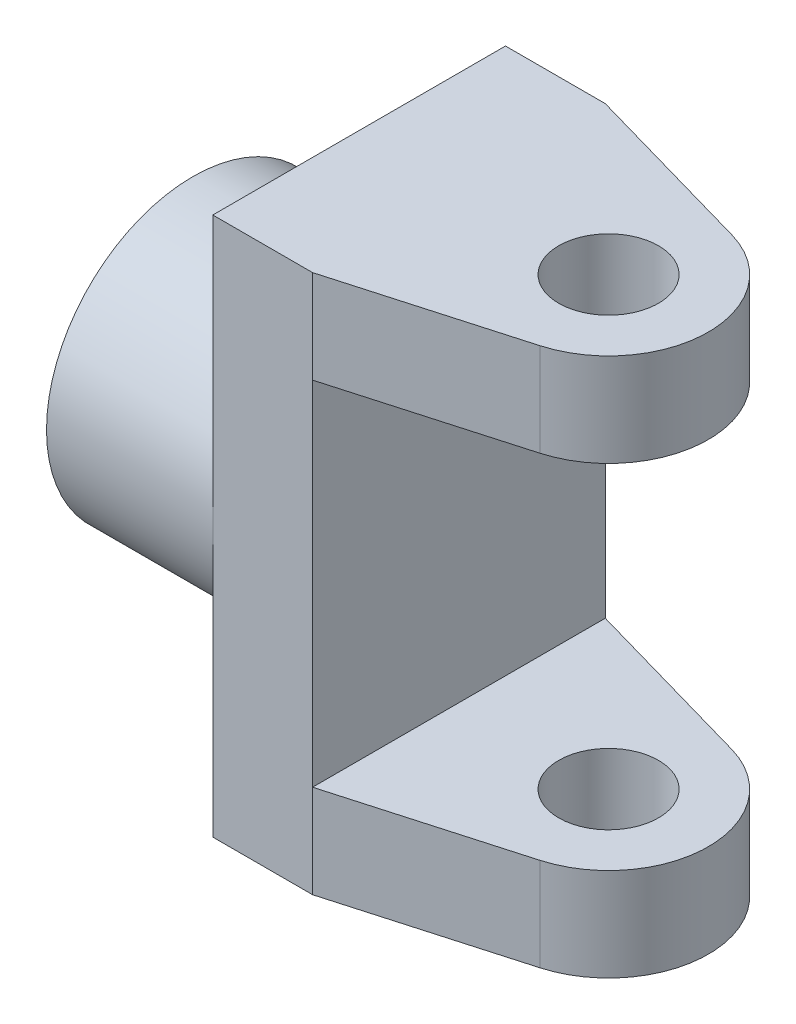
ISO-10303-21;
HEADER;
FILE_DESCRIPTION(('STEP AP214'),'2;1');
FILE_NAME('part.step','',(''),(''),'','','');
FILE_SCHEMA(('AUTOMOTIVE_DESIGN { 1 0 10303 214 1 1 1 1 }'));
ENDSEC;
DATA;
#1=APPLICATION_CONTEXT('core data for automotive mechanical design processes');
#2=APPLICATION_PROTOCOL_DEFINITION('international standard','automotive_design',2000,#1);
#3=PRODUCT_CONTEXT('',#1,'mechanical');
#4=PRODUCT('Part','Part','',(#3));
#5=PRODUCT_RELATED_PRODUCT_CATEGORY('part','',(#4));
#6=PRODUCT_DEFINITION_FORMATION('','',#4);
#7=PRODUCT_DEFINITION_CONTEXT('part definition',#1,'design');
#8=PRODUCT_DEFINITION('design','',#6,#7);
#9=PRODUCT_DEFINITION_SHAPE('','',#8);
#10=(LENGTH_UNIT() NAMED_UNIT(*) SI_UNIT(.MILLI.,.METRE.));
#11=(NAMED_UNIT(*) PLANE_ANGLE_UNIT() SI_UNIT($,.RADIAN.));
#12=(NAMED_UNIT(*) SI_UNIT($,.STERADIAN.) SOLID_ANGLE_UNIT());
#13=UNCERTAINTY_MEASURE_WITH_UNIT(LENGTH_MEASURE(1.E-05),#10,'distance_accuracy_value','');
#14=(GEOMETRIC_REPRESENTATION_CONTEXT(3) GLOBAL_UNCERTAINTY_ASSIGNED_CONTEXT((#13)) GLOBAL_UNIT_ASSIGNED_CONTEXT((#10,
#11,#12)) REPRESENTATION_CONTEXT('',''));
#15=CARTESIAN_POINT('',(0.,0.,0.));
#16=DIRECTION('',(0.,0.,1.));
#17=DIRECTION('',(1.,0.,0.));
#18=AXIS2_PLACEMENT_3D('',#15,#16,#17);
#19=CARTESIAN_POINT('',(38.359674224501,0.356043956043962,57.2253028517175));
#20=DIRECTION('',(1.,0.,0.));
#21=DIRECTION('',(0.,0.,-1.));
#22=AXIS2_PLACEMENT_3D('',#19,#20,#21);
#23=PLANE('',#22);
#24=CARTESIAN_POINT('',(38.359674224501,0.508634222919944,44.0253028517175));
#25=DIRECTION('',(-1.,0.,0.));
#26=DIRECTION('',(0.,0.,1.));
#27=AXIS2_PLACEMENT_3D('',#24,#25,#26);
#28=CIRCLE('',#27,13.2);
#29=CARTESIAN_POINT('',(38.359674224501,0.508634222919944,57.2253028517175));
#30=VERTEX_POINT('',#29);
#31=CARTESIAN_POINT('',(38.359674224501,0.508634222919944,30.8253028517175));
#32=VERTEX_POINT('',#31);
#33=EDGE_CURVE('E64',#30,#32,#28,.T.);
#34=ORIENTED_EDGE('',*,*,#33,.F.);
#35=DIRECTION('',(0.,-1.,0.));
#36=VECTOR('',#35,1.);
#37=CARTESIAN_POINT('',(38.359674224501,0.356043956043962,57.2253028517175));
#38=LINE('',#37,#36);
#39=CARTESIAN_POINT('',(38.359674224501,24.8086342229199,57.2253028517175));
#40=VERTEX_POINT('',#39);
#41=EDGE_CURVE('E274',#40,#30,#38,.T.);
#42=ORIENTED_EDGE('',*,*,#41,.F.);
#43=DIRECTION('',(0.,0.,-1.));
#44=VECTOR('',#43,1.);
#45=CARTESIAN_POINT('',(38.359674224501,24.8086342229199,57.2253028517175));
#46=LINE('',#45,#44);
#47=CARTESIAN_POINT('',(38.359674224501,24.8086342229199,30.8253028517175));
#48=VERTEX_POINT('',#47);
#49=EDGE_CURVE('E290',#40,#48,#46,.T.);
#50=ORIENTED_EDGE('',*,*,#49,.T.);
#51=DIRECTION('',(0.,-1.,0.));
#52=VECTOR('',#51,1.);
#53=CARTESIAN_POINT('',(38.359674224501,0.356043956043962,30.8253028517175));
#54=LINE('',#53,#52);
#55=EDGE_CURVE('E267',#48,#32,#54,.T.);
#56=ORIENTED_EDGE('',*,*,#55,.T.);
#57=EDGE_LOOP('',(#34,#42,#50,#56));
#58=FACE_BOUND('',#57,.T.);
#59=ADVANCED_FACE('F54',(#58),#23,.F.);
#60=CARTESIAN_POINT('',(30.1605696419081,-23.7913657770801,57.2253028517175));
#61=DIRECTION('',(0.,1.,0.));
#62=DIRECTION('',(0.,0.,1.));
#63=AXIS2_PLACEMENT_3D('',#60,#61,#62);
#64=PLANE('',#63);
#65=CARTESIAN_POINT('',(60.859674224501,-23.7913657770801,44.0253028517175));
#66=DIRECTION('',(0.,1.,0.));
#67=DIRECTION('',(-1.,0.,0.));
#68=AXIS2_PLACEMENT_3D('',#65,#66,#67);
#69=CIRCLE('',#68,4.5);
#70=CARTESIAN_POINT('',(56.359674224501,-23.7913657770801,44.0253028517175));
#71=VERTEX_POINT('',#70);
#72=EDGE_CURVE('E205',#71,#71,#69,.T.);
#73=ORIENTED_EDGE('',*,*,#72,.T.);
#74=EDGE_LOOP('',(#73));
#75=FACE_BOUND('',#74,.T.);
#76=CARTESIAN_POINT('',(60.859674224501,-23.7913657770801,44.0253028517175));
#77=DIRECTION('',(0.,1.,0.));
#78=DIRECTION('',(-1.,0.,0.));
#79=AXIS2_PLACEMENT_3D('',#76,#77,#78);
#80=CIRCLE('',#79,9.);
#81=CARTESIAN_POINT('',(63.3235007053642,-23.7913657770801,52.6814890253275));
#82=VERTEX_POINT('',#81);
#83=CARTESIAN_POINT('',(63.3235007053642,-23.7913657770801,35.3691166781074));
#84=VERTEX_POINT('',#83);
#85=EDGE_CURVE('E236',#82,#84,#80,.T.);
#86=ORIENTED_EDGE('',*,*,#85,.F.);
#87=DIRECTION('',(0.961798463734448,0.,-0.273758497873683));
#88=VECTOR('',#87,1.);
#89=CARTESIAN_POINT('',(38.4006677077134,-23.7913657770801,59.7753216539449));
#90=LINE('',#89,#88);
#91=CARTESIAN_POINT('',(47.359674224501,-23.7913657770801,57.2253028517175));
#92=VERTEX_POINT('',#91);
#93=EDGE_CURVE('E217',#92,#82,#90,.T.);
#94=ORIENTED_EDGE('',*,*,#93,.F.);
#95=DIRECTION('',(1.,0.,0.));
#96=VECTOR('',#95,1.);
#97=CARTESIAN_POINT('',(30.1605696419081,-23.7913657770801,57.2253028517175));
#98=LINE('',#97,#96);
#99=CARTESIAN_POINT('',(38.359674224501,-23.7913657770801,57.2253028517175));
#100=VERTEX_POINT('',#99);
#101=EDGE_CURVE('E263',#100,#92,#98,.T.);
#102=ORIENTED_EDGE('',*,*,#101,.F.);
#103=DIRECTION('',(0.,0.,-1.));
#104=VECTOR('',#103,1.);
#105=CARTESIAN_POINT('',(38.359674224501,-23.7913657770801,57.2253028517175));
#106=LINE('',#105,#104);
#107=CARTESIAN_POINT('',(38.359674224501,-23.7913657770801,30.8253028517175));
#108=VERTEX_POINT('',#107);
#109=EDGE_CURVE('E276',#100,#108,#106,.T.);
#110=ORIENTED_EDGE('',*,*,#109,.T.);
#111=DIRECTION('',(1.,0.,0.));
#112=VECTOR('',#111,1.);
#113=CARTESIAN_POINT('',(30.1605696419081,-23.7913657770801,30.8253028517175));
#114=LINE('',#113,#112);
#115=CARTESIAN_POINT('',(47.359674224501,-23.7913657770801,30.8253028517175));
#116=VERTEX_POINT('',#115);
#117=EDGE_CURVE('E262',#108,#116,#114,.T.);
#118=ORIENTED_EDGE('',*,*,#117,.T.);
#119=DIRECTION('',(0.961798463734448,0.,0.273758497873683));
#120=VECTOR('',#119,1.);
#121=CARTESIAN_POINT('',(31.4495344367196,-23.7913657770801,26.2967699693174));
#122=LINE('',#121,#120);
#123=EDGE_CURVE('E238',#116,#84,#122,.T.);
#124=ORIENTED_EDGE('',*,*,#123,.T.);
#125=EDGE_LOOP('',(#86,#94,#102,#110,#118,#124));
#126=FACE_BOUND('',#125,.T.);
#127=ADVANCED_FACE('F56',(#75,#126),#64,.F.);
#128=CARTESIAN_POINT('',(30.1605696419081,-15.3913657770801,57.2253028517175));
#129=DIRECTION('',(0.,1.,0.));
#130=DIRECTION('',(0.,0.,1.));
#131=AXIS2_PLACEMENT_3D('',#128,#129,#130);
#132=PLANE('',#131);
#133=CARTESIAN_POINT('',(60.859674224501,-15.3913657770801,44.0253028517175));
#134=DIRECTION('',(0.,1.,0.));
#135=DIRECTION('',(0.,0.,1.));
#136=AXIS2_PLACEMENT_3D('',#133,#134,#135);
#137=CIRCLE('',#136,4.5);
#138=CARTESIAN_POINT('',(60.859674224501,-15.3913657770801,48.5253028517175));
#139=VERTEX_POINT('',#138);
#140=EDGE_CURVE('E213',#139,#139,#137,.T.);
#141=ORIENTED_EDGE('',*,*,#140,.F.);
#142=EDGE_LOOP('',(#141));
#143=FACE_BOUND('',#142,.T.);
#144=DIRECTION('',(0.961798463734448,0.,-0.273758497873683));
#145=VECTOR('',#144,1.);
#146=CARTESIAN_POINT('',(31.4495344367196,-15.3913657770801,61.7538357341176));
#147=LINE('',#146,#145);
#148=CARTESIAN_POINT('',(47.359674224501,-15.3913657770801,57.2253028517175));
#149=VERTEX_POINT('',#148);
#150=CARTESIAN_POINT('',(63.3235007053642,-15.3913657770801,52.6814890253275));
#151=VERTEX_POINT('',#150);
#152=EDGE_CURVE('E232',#149,#151,#147,.T.);
#153=ORIENTED_EDGE('',*,*,#152,.T.);
#154=CARTESIAN_POINT('',(60.859674224501,-15.3913657770801,44.0253028517175));
#155=DIRECTION('',(0.,1.,0.));
#156=DIRECTION('',(0.,0.,1.));
#157=AXIS2_PLACEMENT_3D('',#154,#155,#156);
#158=CIRCLE('',#157,9.);
#159=CARTESIAN_POINT('',(63.3235007053642,-15.3913657770801,35.3691166781074));
#160=VERTEX_POINT('',#159);
#161=EDGE_CURVE('E259',#151,#160,#158,.T.);
#162=ORIENTED_EDGE('',*,*,#161,.T.);
#163=DIRECTION('',(0.961798463734448,0.,0.273758497873683));
#164=VECTOR('',#163,1.);
#165=CARTESIAN_POINT('',(38.4006677077134,-15.3913657770801,28.27528404949));
#166=LINE('',#165,#164);
#167=CARTESIAN_POINT('',(47.359674224501,-15.3913657770801,30.8253028517175));
#168=VERTEX_POINT('',#167);
#169=EDGE_CURVE('E255',#168,#160,#166,.T.);
#170=ORIENTED_EDGE('',*,*,#169,.F.);
#171=DIRECTION('',(0.,0.,-1.));
#172=VECTOR('',#171,1.);
#173=CARTESIAN_POINT('',(47.359674224501,-15.3913657770801,57.2253028517175));
#174=LINE('',#173,#172);
#175=EDGE_CURVE('E295',#149,#168,#174,.T.);
#176=ORIENTED_EDGE('',*,*,#175,.F.);
#177=EDGE_LOOP('',(#153,#162,#170,#176));
#178=FACE_BOUND('',#177,.T.);
#179=ADVANCED_FACE('F325',(#143,#178),#132,.T.);
#180=CARTESIAN_POINT('',(30.1605696419081,16.4086342229199,57.2253028517175));
#181=DIRECTION('',(0.,1.,0.));
#182=DIRECTION('',(0.,0.,1.));
#183=AXIS2_PLACEMENT_3D('',#180,#181,#182);
#184=PLANE('',#183);
#185=CARTESIAN_POINT('',(60.859674224501,16.40863422292,44.0253028517175));
#186=DIRECTION('',(0.,1.,0.));
#187=DIRECTION('',(0.,0.,1.));
#188=AXIS2_PLACEMENT_3D('',#185,#186,#187);
#189=CIRCLE('',#188,4.5);
#190=CARTESIAN_POINT('',(60.859674224501,16.40863422292,48.5253028517175));
#191=VERTEX_POINT('',#190);
#192=EDGE_CURVE('E208',#191,#191,#189,.T.);
#193=ORIENTED_EDGE('',*,*,#192,.T.);
#194=EDGE_LOOP('',(#193));
#195=FACE_BOUND('',#194,.T.);
#196=CARTESIAN_POINT('',(60.859674224501,16.40863422292,44.0253028517175));
#197=DIRECTION('',(0.,1.,0.));
#198=DIRECTION('',(0.,0.,1.));
#199=AXIS2_PLACEMENT_3D('',#196,#197,#198);
#200=CIRCLE('',#199,9.);
#201=CARTESIAN_POINT('',(63.3235007053641,16.40863422292,52.6814890253275));
#202=VERTEX_POINT('',#201);
#203=CARTESIAN_POINT('',(63.3235007053641,16.40863422292,35.3691166781074));
#204=VERTEX_POINT('',#203);
#205=EDGE_CURVE('E257',#202,#204,#200,.T.);
#206=ORIENTED_EDGE('',*,*,#205,.F.);
#207=DIRECTION('',(0.961798463734448,0.,-0.273758497873683));
#208=VECTOR('',#207,1.);
#209=CARTESIAN_POINT('',(31.4495344367196,16.4086342229199,61.7538357341176));
#210=LINE('',#209,#208);
#211=CARTESIAN_POINT('',(47.359674224501,16.4086342229199,57.2253028517175));
#212=VERTEX_POINT('',#211);
#213=EDGE_CURVE('E226',#212,#202,#210,.T.);
#214=ORIENTED_EDGE('',*,*,#213,.F.);
#215=DIRECTION('',(0.,0.,-1.));
#216=VECTOR('',#215,1.);
#217=CARTESIAN_POINT('',(47.359674224501,16.4086342229199,57.2253028517175));
#218=LINE('',#217,#216);
#219=CARTESIAN_POINT('',(47.359674224501,16.4086342229199,30.8253028517175));
#220=VERTEX_POINT('',#219);
#221=EDGE_CURVE('E292',#212,#220,#218,.T.);
#222=ORIENTED_EDGE('',*,*,#221,.T.);
#223=DIRECTION('',(0.961798463734448,0.,0.273758497873683));
#224=VECTOR('',#223,1.);
#225=CARTESIAN_POINT('',(38.4006677077134,16.4086342229199,28.27528404949));
#226=LINE('',#225,#224);
#227=EDGE_CURVE('E250',#220,#204,#226,.T.);
#228=ORIENTED_EDGE('',*,*,#227,.T.);
#229=EDGE_LOOP('',(#206,#214,#222,#228));
#230=FACE_BOUND('',#229,.T.);
#231=ADVANCED_FACE('F331',(#195,#230),#184,.F.);
#232=CARTESIAN_POINT('',(30.1605696419081,24.8086342229199,57.2253028517175));
#233=DIRECTION('',(0.,1.,0.));
#234=DIRECTION('',(-1.,0.,0.));
#235=AXIS2_PLACEMENT_3D('',#232,#233,#234);
#236=PLANE('',#235);
#237=CARTESIAN_POINT('',(60.859674224501,24.8086342229199,44.0253028517175));
#238=DIRECTION('',(0.,1.,0.));
#239=DIRECTION('',(-1.,0.,0.));
#240=AXIS2_PLACEMENT_3D('',#237,#238,#239);
#241=CIRCLE('',#240,4.5);
#242=CARTESIAN_POINT('',(56.359674224501,24.8086342229199,44.0253028517175));
#243=VERTEX_POINT('',#242);
#244=EDGE_CURVE('E202',#243,#243,#241,.T.);
#245=ORIENTED_EDGE('',*,*,#244,.F.);
#246=EDGE_LOOP('',(#245));
#247=FACE_BOUND('',#246,.T.);
#248=DIRECTION('',(0.961798463734448,0.,-0.273758497873683));
#249=VECTOR('',#248,1.);
#250=CARTESIAN_POINT('',(38.4006677077134,24.8086342229199,59.7753216539449));
#251=LINE('',#250,#249);
#252=CARTESIAN_POINT('',(47.359674224501,24.8086342229199,57.2253028517175));
#253=VERTEX_POINT('',#252);
#254=CARTESIAN_POINT('',(63.3235007053641,24.8086342229199,52.6814890253275));
#255=VERTEX_POINT('',#254);
#256=EDGE_CURVE('E216',#253,#255,#251,.T.);
#257=ORIENTED_EDGE('',*,*,#256,.T.);
#258=CARTESIAN_POINT('',(60.859674224501,24.8086342229199,44.0253028517175));
#259=DIRECTION('',(0.,1.,0.));
#260=DIRECTION('',(-1.,0.,0.));
#261=AXIS2_PLACEMENT_3D('',#258,#259,#260);
#262=CIRCLE('',#261,9.);
#263=CARTESIAN_POINT('',(63.3235007053641,24.8086342229199,35.3691166781074));
#264=VERTEX_POINT('',#263);
#265=EDGE_CURVE('E235',#255,#264,#262,.T.);
#266=ORIENTED_EDGE('',*,*,#265,.T.);
#267=DIRECTION('',(0.961798463734448,0.,0.273758497873683));
#268=VECTOR('',#267,1.);
#269=CARTESIAN_POINT('',(31.4495344367196,24.8086342229199,26.2967699693174));
#270=LINE('',#269,#268);
#271=CARTESIAN_POINT('',(47.359674224501,24.8086342229199,30.8253028517175));
#272=VERTEX_POINT('',#271);
#273=EDGE_CURVE('E239',#272,#264,#270,.T.);
#274=ORIENTED_EDGE('',*,*,#273,.F.);
#275=DIRECTION('',(1.,0.,0.));
#276=VECTOR('',#275,1.);
#277=CARTESIAN_POINT('',(30.1605696419081,24.8086342229199,30.8253028517175));
#278=LINE('',#277,#276);
#279=EDGE_CURVE('E282',#48,#272,#278,.T.);
#280=ORIENTED_EDGE('',*,*,#279,.F.);
#281=ORIENTED_EDGE('',*,*,#49,.F.);
#282=DIRECTION('',(1.,0.,0.));
#283=VECTOR('',#282,1.);
#284=CARTESIAN_POINT('',(30.1605696419081,24.8086342229199,57.2253028517175));
#285=LINE('',#284,#283);
#286=EDGE_CURVE('E270',#40,#253,#285,.T.);
#287=ORIENTED_EDGE('',*,*,#286,.T.);
#288=EDGE_LOOP('',(#257,#266,#274,#280,#281,#287));
#289=FACE_BOUND('',#288,.T.);
#290=ADVANCED_FACE('F308',(#247,#289),#236,.T.);
#291=CARTESIAN_POINT('',(30.1605696419081,0.356043956043962,57.2253028517175));
#292=DIRECTION('',(0.,0.,1.));
#293=DIRECTION('',(1.,0.,0.));
#294=AXIS2_PLACEMENT_3D('',#291,#292,#293);
#295=PLANE('',#294);
#296=ORIENTED_EDGE('',*,*,#101,.T.);
#297=DIRECTION('',(0.,1.,0.));
#298=VECTOR('',#297,1.);
#299=CARTESIAN_POINT('',(47.359674224501,-23.7913657770801,57.2253028517175));
#300=LINE('',#299,#298);
#301=EDGE_CURVE('E223',#92,#149,#300,.T.);
#302=ORIENTED_EDGE('',*,*,#301,.T.);
#303=DIRECTION('',(0.,-1.,0.));
#304=VECTOR('',#303,1.);
#305=CARTESIAN_POINT('',(47.359674224501,0.356043956043965,57.2253028517175));
#306=LINE('',#305,#304);
#307=EDGE_CURVE('E266',#212,#149,#306,.T.);
#308=ORIENTED_EDGE('',*,*,#307,.F.);
#309=DIRECTION('',(0.,1.,0.));
#310=VECTOR('',#309,1.);
#311=CARTESIAN_POINT('',(47.359674224501,0.356043956043965,57.2253028517175));
#312=LINE('',#311,#310);
#313=EDGE_CURVE('E58',#212,#253,#312,.T.);
#314=ORIENTED_EDGE('',*,*,#313,.T.);
#315=ORIENTED_EDGE('',*,*,#286,.F.);
#316=ORIENTED_EDGE('',*,*,#41,.T.);
#317=EDGE_CURVE('E273',#30,#100,#38,.T.);
#318=ORIENTED_EDGE('',*,*,#317,.T.);
#319=EDGE_LOOP('',(#296,#302,#308,#314,#315,#316,#318));
#320=FACE_BOUND('',#319,.T.);
#321=ADVANCED_FACE('F304',(#320),#295,.T.);
#322=CARTESIAN_POINT('',(47.359674224501,0.356043956043965,57.2253028517175));
#323=DIRECTION('',(1.,0.,0.));
#324=DIRECTION('',(0.,1.,0.));
#325=AXIS2_PLACEMENT_3D('',#322,#323,#324);
#326=PLANE('',#325);
#327=DIRECTION('',(0.,-1.,0.));
#328=VECTOR('',#327,1.);
#329=CARTESIAN_POINT('',(47.359674224501,0.356043956043965,30.8253028517175));
#330=LINE('',#329,#328);
#331=EDGE_CURVE('E279',#220,#168,#330,.T.);
#332=ORIENTED_EDGE('',*,*,#331,.F.);
#333=ORIENTED_EDGE('',*,*,#221,.F.);
#334=ORIENTED_EDGE('',*,*,#307,.T.);
#335=ORIENTED_EDGE('',*,*,#175,.T.);
#336=EDGE_LOOP('',(#332,#333,#334,#335));
#337=FACE_BOUND('',#336,.T.);
#338=ADVANCED_FACE('F329',(#337),#326,.T.);
#339=EDGE_CURVE('E12',#32,#30,#28,.T.);
#340=ORIENTED_EDGE('',*,*,#339,.F.);
#341=EDGE_CURVE('E285',#32,#108,#54,.T.);
#342=ORIENTED_EDGE('',*,*,#341,.T.);
#343=ORIENTED_EDGE('',*,*,#109,.F.);
#344=ORIENTED_EDGE('',*,*,#317,.F.);
#345=EDGE_LOOP('',(#340,#342,#343,#344));
#346=FACE_BOUND('',#345,.T.);
#347=ADVANCED_FACE('F316',(#346),#23,.F.);
#348=CARTESIAN_POINT('',(30.1605696419081,0.356043956043962,30.8253028517175));
#349=DIRECTION('',(0.,0.,1.));
#350=DIRECTION('',(1.,0.,0.));
#351=AXIS2_PLACEMENT_3D('',#348,#349,#350);
#352=PLANE('',#351);
#353=ORIENTED_EDGE('',*,*,#279,.T.);
#354=DIRECTION('',(0.,-1.,0.));
#355=VECTOR('',#354,1.);
#356=CARTESIAN_POINT('',(47.359674224501,0.356043956043965,30.8253028517175));
#357=LINE('',#356,#355);
#358=EDGE_CURVE('E297',#272,#220,#357,.T.);
#359=ORIENTED_EDGE('',*,*,#358,.T.);
#360=ORIENTED_EDGE('',*,*,#331,.T.);
#361=DIRECTION('',(0.,1.,0.));
#362=VECTOR('',#361,1.);
#363=CARTESIAN_POINT('',(47.359674224501,-23.7913657770801,30.8253028517175));
#364=LINE('',#363,#362);
#365=EDGE_CURVE('E242',#116,#168,#364,.T.);
#366=ORIENTED_EDGE('',*,*,#365,.F.);
#367=ORIENTED_EDGE('',*,*,#117,.F.);
#368=ORIENTED_EDGE('',*,*,#341,.F.);
#369=ORIENTED_EDGE('',*,*,#55,.F.);
#370=EDGE_LOOP('',(#353,#359,#360,#366,#367,#368,#369));
#371=FACE_BOUND('',#370,.T.);
#372=ADVANCED_FACE('F339',(#371),#352,.F.);
#373=CARTESIAN_POINT('',(31.4495344367196,-23.7913657770801,26.2967699693174));
#374=DIRECTION('',(-0.273758497873683,0.,0.961798463734448));
#375=DIRECTION('',(0.961798463734448,0.,0.273758497873683));
#376=AXIS2_PLACEMENT_3D('',#373,#374,#375);
#377=PLANE('',#376);
#378=ORIENTED_EDGE('',*,*,#169,.T.);
#379=DIRECTION('',(0.,1.,0.));
#380=VECTOR('',#379,1.);
#381=CARTESIAN_POINT('',(63.3235007053642,-23.7913657770801,35.3691166781074));
#382=LINE('',#381,#380);
#383=EDGE_CURVE('E247',#84,#160,#382,.T.);
#384=ORIENTED_EDGE('',*,*,#383,.F.);
#385=ORIENTED_EDGE('',*,*,#123,.F.);
#386=ORIENTED_EDGE('',*,*,#365,.T.);
#387=EDGE_LOOP('',(#378,#384,#385,#386));
#388=FACE_BOUND('',#387,.T.);
#389=ADVANCED_FACE('F439',(#388),#377,.F.);
#390=CARTESIAN_POINT('',(60.859674224501,-23.7913657770801,44.0253028517175));
#391=DIRECTION('',(0.,1.,0.));
#392=DIRECTION('',(-1.,0.,0.));
#393=AXIS2_PLACEMENT_3D('',#390,#391,#392);
#394=CYLINDRICAL_SURFACE('',#393,9.);
#395=ORIENTED_EDGE('',*,*,#161,.F.);
#396=DIRECTION('',(0.,1.,0.));
#397=VECTOR('',#396,1.);
#398=CARTESIAN_POINT('',(63.3235007053642,-23.7913657770801,52.6814890253275));
#399=LINE('',#398,#397);
#400=EDGE_CURVE('E227',#82,#151,#399,.T.);
#401=ORIENTED_EDGE('',*,*,#400,.F.);
#402=ORIENTED_EDGE('',*,*,#85,.T.);
#403=ORIENTED_EDGE('',*,*,#383,.T.);
#404=EDGE_LOOP('',(#395,#401,#402,#403));
#405=FACE_BOUND('',#404,.T.);
#406=ADVANCED_FACE('F447',(#405),#394,.T.);
#407=ORIENTED_EDGE('',*,*,#205,.T.);
#408=EDGE_CURVE('E251',#204,#264,#382,.T.);
#409=ORIENTED_EDGE('',*,*,#408,.T.);
#410=ORIENTED_EDGE('',*,*,#265,.F.);
#411=EDGE_CURVE('E220',#202,#255,#399,.T.);
#412=ORIENTED_EDGE('',*,*,#411,.F.);
#413=EDGE_LOOP('',(#407,#409,#410,#412));
#414=FACE_BOUND('',#413,.T.);
#415=ADVANCED_FACE('F336',(#414),#394,.T.);
#416=ORIENTED_EDGE('',*,*,#358,.F.);
#417=ORIENTED_EDGE('',*,*,#273,.T.);
#418=ORIENTED_EDGE('',*,*,#408,.F.);
#419=ORIENTED_EDGE('',*,*,#227,.F.);
#420=EDGE_LOOP('',(#416,#417,#418,#419));
#421=FACE_BOUND('',#420,.T.);
#422=ADVANCED_FACE('F430',(#421),#377,.F.);
#423=CARTESIAN_POINT('',(38.4006677077134,-23.7913657770801,59.7753216539449));
#424=DIRECTION('',(0.273758497873683,0.,0.961798463734448));
#425=DIRECTION('',(0.961798463734448,0.,-0.273758497873683));
#426=AXIS2_PLACEMENT_3D('',#423,#424,#425);
#427=PLANE('',#426);
#428=ORIENTED_EDGE('',*,*,#213,.T.);
#429=ORIENTED_EDGE('',*,*,#411,.T.);
#430=ORIENTED_EDGE('',*,*,#256,.F.);
#431=ORIENTED_EDGE('',*,*,#313,.F.);
#432=EDGE_LOOP('',(#428,#429,#430,#431));
#433=FACE_BOUND('',#432,.T.);
#434=ADVANCED_FACE('F334',(#433),#427,.T.);
#435=ORIENTED_EDGE('',*,*,#301,.F.);
#436=ORIENTED_EDGE('',*,*,#93,.T.);
#437=ORIENTED_EDGE('',*,*,#400,.T.);
#438=ORIENTED_EDGE('',*,*,#152,.F.);
#439=EDGE_LOOP('',(#435,#436,#437,#438));
#440=FACE_BOUND('',#439,.T.);
#441=ADVANCED_FACE('F413',(#440),#427,.T.);
#442=CARTESIAN_POINT('',(60.859674224501,-23.7913657770801,44.0253028517175));
#443=DIRECTION('',(0.,1.,0.));
#444=DIRECTION('',(-1.,0.,0.));
#445=AXIS2_PLACEMENT_3D('',#442,#443,#444);
#446=CYLINDRICAL_SURFACE('',#445,4.5);
#447=ORIENTED_EDGE('',*,*,#244,.T.);
#448=EDGE_LOOP('',(#447));
#449=FACE_BOUND('',#448,.T.);
#450=ORIENTED_EDGE('',*,*,#192,.F.);
#451=EDGE_LOOP('',(#450));
#452=FACE_BOUND('',#451,.T.);
#453=ADVANCED_FACE('F351',(#449,#452),#446,.F.);
#454=ORIENTED_EDGE('',*,*,#140,.T.);
#455=EDGE_LOOP('',(#454));
#456=FACE_BOUND('',#455,.T.);
#457=ORIENTED_EDGE('',*,*,#72,.F.);
#458=EDGE_LOOP('',(#457));
#459=FACE_BOUND('',#458,.T.);
#460=ADVANCED_FACE('F343',(#456,#459),#446,.F.);
#461=CARTESIAN_POINT('',(23.359674224501,0.508634222919944,44.0253028517175));
#462=DIRECTION('',(1.,0.,0.));
#463=DIRECTION('',(0.,0.,-1.));
#464=AXIS2_PLACEMENT_3D('',#461,#462,#463);
#465=CYLINDRICAL_SURFACE('',#464,13.2);
#466=CARTESIAN_POINT('',(23.359674224501,0.508634222919944,44.0253028517175));
#467=DIRECTION('',(-1.,0.,0.));
#468=DIRECTION('',(0.,0.,1.));
#469=AXIS2_PLACEMENT_3D('',#466,#467,#468);
#470=CIRCLE('',#469,13.2);
#471=CARTESIAN_POINT('',(23.359674224501,0.508634222919944,57.2253028517175));
#472=VERTEX_POINT('',#471);
#473=EDGE_CURVE('E200',#472,#472,#470,.T.);
#474=ORIENTED_EDGE('',*,*,#473,.F.);
#475=EDGE_LOOP('',(#474));
#476=FACE_BOUND('',#475,.T.);
#477=ORIENTED_EDGE('',*,*,#33,.T.);
#478=ORIENTED_EDGE('',*,*,#339,.T.);
#479=EDGE_LOOP('',(#477,#478));
#480=FACE_BOUND('',#479,.T.);
#481=ADVANCED_FACE('F341',(#476,#480),#465,.T.);
#482=CARTESIAN_POINT('',(23.359674224501,0.508634222919944,44.0253028517175));
#483=DIRECTION('',(-1.,0.,0.));
#484=DIRECTION('',(0.,0.,1.));
#485=AXIS2_PLACEMENT_3D('',#482,#483,#484);
#486=PLANE('',#485);
#487=DIRECTION('',(0.,0.,-1.));
#488=VECTOR('',#487,1.);
#489=CARTESIAN_POINT('',(23.359674224501,-0.691365777080056,38.1465274690378));
#490=LINE('',#489,#488);
#491=CARTESIAN_POINT('',(23.359674224501,-0.691365777080056,38.1465274690378));
#492=VERTEX_POINT('',#491);
#493=CARTESIAN_POINT('',(23.359674224501,-0.691365777080056,36.9465274690379));
#494=VERTEX_POINT('',#493);
#495=EDGE_CURVE('E171',#492,#494,#490,.T.);
#496=ORIENTED_EDGE('',*,*,#495,.T.);
#497=DIRECTION('',(0.,-1.,0.));
#498=VECTOR('',#497,1.);
#499=CARTESIAN_POINT('',(23.359674224501,1.70863422291994,36.9465274690378));
#500=LINE('',#499,#498);
#501=CARTESIAN_POINT('',(23.359674224501,1.70863422291994,36.9465274690378));
#502=VERTEX_POINT('',#501);
#503=EDGE_CURVE('E161',#502,#494,#500,.T.);
#504=ORIENTED_EDGE('',*,*,#503,.F.);
#505=DIRECTION('',(0.,0.,-1.));
#506=VECTOR('',#505,1.);
#507=CARTESIAN_POINT('',(23.359674224501,1.70863422291994,38.1465274690378));
#508=LINE('',#507,#506);
#509=CARTESIAN_POINT('',(23.359674224501,1.70863422291994,38.1465274690378));
#510=VERTEX_POINT('',#509);
#511=EDGE_CURVE('E170',#510,#502,#508,.T.);
#512=ORIENTED_EDGE('',*,*,#511,.F.);
#513=CARTESIAN_POINT('',(23.359674224501,0.508634222919944,44.0253028517175));
#514=DIRECTION('',(-1.,0.,0.));
#515=DIRECTION('',(0.,0.,1.));
#516=AXIS2_PLACEMENT_3D('',#513,#514,#515);
#517=CIRCLE('',#516,6.);
#518=EDGE_CURVE('E179',#492,#510,#517,.T.);
#519=ORIENTED_EDGE('',*,*,#518,.F.);
#520=EDGE_LOOP('',(#496,#504,#512,#519));
#521=FACE_BOUND('',#520,.T.);
#522=ORIENTED_EDGE('',*,*,#473,.T.);
#523=EDGE_LOOP('',(#522));
#524=FACE_BOUND('',#523,.T.);
#525=ADVANCED_FACE('F181',(#521,#524),#486,.T.);
#526=CARTESIAN_POINT('',(23.359674224501,-0.691365777080056,38.1465274690378));
#527=DIRECTION('',(0.,-1.,0.));
#528=DIRECTION('',(0.,0.,-1.));
#529=AXIS2_PLACEMENT_3D('',#526,#527,#528);
#530=PLANE('',#529);
#531=DIRECTION('',(0.,0.,-1.));
#532=VECTOR('',#531,1.);
#533=CARTESIAN_POINT('',(38.359674224501,-0.691365777080056,38.1465274690378));
#534=LINE('',#533,#532);
#535=CARTESIAN_POINT('',(38.359674224501,-0.691365777080056,38.1465274690378));
#536=VERTEX_POINT('',#535);
#537=CARTESIAN_POINT('',(38.359674224501,-0.691365777080057,36.9465274690379));
#538=VERTEX_POINT('',#537);
#539=EDGE_CURVE('E178',#536,#538,#534,.T.);
#540=ORIENTED_EDGE('',*,*,#539,.T.);
#541=DIRECTION('',(1.,0.,0.));
#542=VECTOR('',#541,1.);
#543=CARTESIAN_POINT('',(23.359674224501,-0.691365777080056,36.9465274690379));
#544=LINE('',#543,#542);
#545=EDGE_CURVE('E164',#494,#538,#544,.T.);
#546=ORIENTED_EDGE('',*,*,#545,.F.);
#547=ORIENTED_EDGE('',*,*,#495,.F.);
#548=DIRECTION('',(1.,0.,0.));
#549=VECTOR('',#548,1.);
#550=CARTESIAN_POINT('',(23.359674224501,-0.691365777080056,38.1465274690378));
#551=LINE('',#550,#549);
#552=EDGE_CURVE('E195',#492,#536,#551,.T.);
#553=ORIENTED_EDGE('',*,*,#552,.T.);
#554=EDGE_LOOP('',(#540,#546,#547,#553));
#555=FACE_BOUND('',#554,.T.);
#556=ADVANCED_FACE('F175',(#555),#530,.F.);
#557=CARTESIAN_POINT('',(23.359674224501,0.508634222919944,44.0253028517175));
#558=DIRECTION('',(1.,0.,0.));
#559=DIRECTION('',(0.,0.,-1.));
#560=AXIS2_PLACEMENT_3D('',#557,#558,#559);
#561=CYLINDRICAL_SURFACE('',#560,6.);
#562=CARTESIAN_POINT('',(38.359674224501,0.508634222919944,44.0253028517175));
#563=DIRECTION('',(-1.,0.,0.));
#564=DIRECTION('',(0.,0.,1.));
#565=AXIS2_PLACEMENT_3D('',#562,#563,#564);
#566=CIRCLE('',#565,6.);
#567=CARTESIAN_POINT('',(38.359674224501,1.70863422291994,38.1465274690378));
#568=VERTEX_POINT('',#567);
#569=EDGE_CURVE('E183',#536,#568,#566,.T.);
#570=ORIENTED_EDGE('',*,*,#569,.F.);
#571=ORIENTED_EDGE('',*,*,#552,.F.);
#572=ORIENTED_EDGE('',*,*,#518,.T.);
#573=DIRECTION('',(1.,0.,0.));
#574=VECTOR('',#573,1.);
#575=CARTESIAN_POINT('',(23.359674224501,1.70863422291994,38.1465274690378));
#576=LINE('',#575,#574);
#577=EDGE_CURVE('E197',#510,#568,#576,.T.);
#578=ORIENTED_EDGE('',*,*,#577,.T.);
#579=EDGE_LOOP('',(#570,#571,#572,#578));
#580=FACE_BOUND('',#579,.T.);
#581=ADVANCED_FACE('F377',(#580),#561,.F.);
#582=CARTESIAN_POINT('',(23.359674224501,1.70863422291994,38.1465274690378));
#583=DIRECTION('',(0.,-1.,0.));
#584=DIRECTION('',(0.,0.,-1.));
#585=AXIS2_PLACEMENT_3D('',#582,#583,#584);
#586=PLANE('',#585);
#587=DIRECTION('',(0.,0.,-1.));
#588=VECTOR('',#587,1.);
#589=CARTESIAN_POINT('',(38.359674224501,1.70863422291994,38.1465274690378));
#590=LINE('',#589,#588);
#591=CARTESIAN_POINT('',(38.359674224501,1.70863422291994,36.9465274690378));
#592=VERTEX_POINT('',#591);
#593=EDGE_CURVE('E186',#568,#592,#590,.T.);
#594=ORIENTED_EDGE('',*,*,#593,.F.);
#595=ORIENTED_EDGE('',*,*,#577,.F.);
#596=ORIENTED_EDGE('',*,*,#511,.T.);
#597=DIRECTION('',(1.,0.,0.));
#598=VECTOR('',#597,1.);
#599=CARTESIAN_POINT('',(23.359674224501,1.70863422291994,36.9465274690378));
#600=LINE('',#599,#598);
#601=EDGE_CURVE('E165',#502,#592,#600,.T.);
#602=ORIENTED_EDGE('',*,*,#601,.T.);
#603=EDGE_LOOP('',(#594,#595,#596,#602));
#604=FACE_BOUND('',#603,.T.);
#605=ADVANCED_FACE('F370',(#604),#586,.T.);
#606=CARTESIAN_POINT('',(23.359674224501,1.70863422291994,36.9465274690378));
#607=DIRECTION('',(0.,0.,1.));
#608=DIRECTION('',(0.,-1.,0.));
#609=AXIS2_PLACEMENT_3D('',#606,#607,#608);
#610=PLANE('',#609);
#611=DIRECTION('',(0.,-1.,0.));
#612=VECTOR('',#611,1.);
#613=CARTESIAN_POINT('',(38.359674224501,1.70863422291994,36.9465274690378));
#614=LINE('',#613,#612);
#615=EDGE_CURVE('E71',#592,#538,#614,.T.);
#616=ORIENTED_EDGE('',*,*,#615,.F.);
#617=ORIENTED_EDGE('',*,*,#601,.F.);
#618=ORIENTED_EDGE('',*,*,#503,.T.);
#619=ORIENTED_EDGE('',*,*,#545,.T.);
#620=EDGE_LOOP('',(#616,#617,#618,#619));
#621=FACE_BOUND('',#620,.T.);
#622=ADVANCED_FACE('F163',(#621),#610,.T.);
#623=ORIENTED_EDGE('',*,*,#593,.T.);
#624=ORIENTED_EDGE('',*,*,#615,.T.);
#625=ORIENTED_EDGE('',*,*,#539,.F.);
#626=ORIENTED_EDGE('',*,*,#569,.T.);
#627=EDGE_LOOP('',(#623,#624,#625,#626));
#628=FACE_BOUND('',#627,.T.);
#629=ADVANCED_FACE('F357',(#628),#23,.F.);
#630=CLOSED_SHELL('',(#59,#127,#179,#231,#290,#321,#338,#347,#372,#389,#406,#415,#422,#434,#441,
#453,#460,#481,#525,#556,#581,#605,#622,#629));
#631=MANIFOLD_SOLID_BREP('B2',#630);
#632=ADVANCED_BREP_SHAPE_REPRESENTATION('',(#18,#631),#14);
#633=SHAPE_DEFINITION_REPRESENTATION(#9,#632);
ENDSEC;
END-ISO-10303-21;
